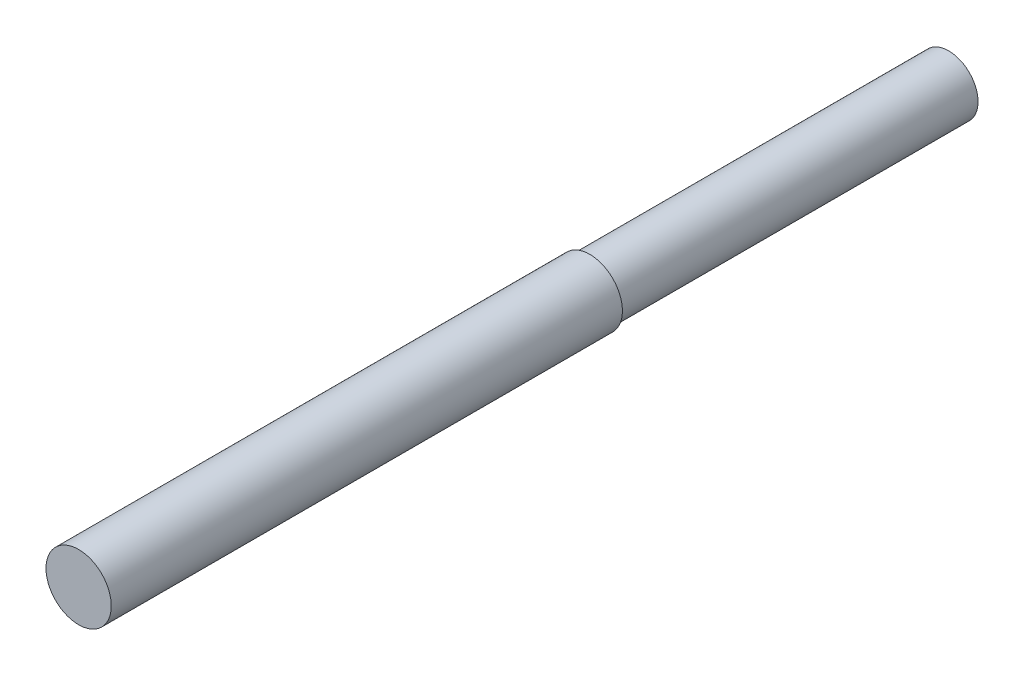
ISO-10303-21;
HEADER;
FILE_DESCRIPTION(('STEP AP214'),'2;1');
FILE_NAME('part.step','',(''),(''),'','','');
FILE_SCHEMA(('AUTOMOTIVE_DESIGN { 1 0 10303 214 1 1 1 1 }'));
ENDSEC;
DATA;
#1=APPLICATION_CONTEXT('core data for automotive mechanical design processes');
#2=APPLICATION_PROTOCOL_DEFINITION('international standard','automotive_design',2000,#1);
#3=PRODUCT_CONTEXT('',#1,'mechanical');
#4=PRODUCT('Part','Part','',(#3));
#5=PRODUCT_RELATED_PRODUCT_CATEGORY('part','',(#4));
#6=PRODUCT_DEFINITION_FORMATION('','',#4);
#7=PRODUCT_DEFINITION_CONTEXT('part definition',#1,'design');
#8=PRODUCT_DEFINITION('design','',#6,#7);
#9=PRODUCT_DEFINITION_SHAPE('','',#8);
#10=(LENGTH_UNIT() NAMED_UNIT(*) SI_UNIT(.MILLI.,.METRE.));
#11=(NAMED_UNIT(*) PLANE_ANGLE_UNIT() SI_UNIT($,.RADIAN.));
#12=(NAMED_UNIT(*) SI_UNIT($,.STERADIAN.) SOLID_ANGLE_UNIT());
#13=UNCERTAINTY_MEASURE_WITH_UNIT(LENGTH_MEASURE(1.E-05),#10,'distance_accuracy_value','');
#14=(GEOMETRIC_REPRESENTATION_CONTEXT(3) GLOBAL_UNCERTAINTY_ASSIGNED_CONTEXT((#13)) GLOBAL_UNIT_ASSIGNED_CONTEXT((#10,
#11,#12)) REPRESENTATION_CONTEXT('',''));
#15=CARTESIAN_POINT('',(0.,0.,0.));
#16=DIRECTION('',(0.,0.,1.));
#17=DIRECTION('',(1.,0.,0.));
#18=AXIS2_PLACEMENT_3D('',#15,#16,#17);
#19=CARTESIAN_POINT('',(0.,0.,470.));
#20=DIRECTION('',(0.,0.,-1.));
#21=DIRECTION('',(-1.,0.,0.));
#22=AXIS2_PLACEMENT_3D('',#19,#20,#21);
#23=CYLINDRICAL_SURFACE('',#22,30.);
#24=CARTESIAN_POINT('',(0.,0.,470.));
#25=DIRECTION('',(0.,0.,1.));
#26=DIRECTION('',(1.,0.,0.));
#27=AXIS2_PLACEMENT_3D('',#24,#25,#26);
#28=CIRCLE('',#27,30.);
#29=CARTESIAN_POINT('',(-30.,0.,470.));
#30=VERTEX_POINT('',#29);
#31=EDGE_CURVE('E44',#30,#30,#28,.T.);
#32=CARTESIAN_POINT('',(0.,0.,0.));
#33=DIRECTION('',(0.,0.,1.));
#34=DIRECTION('',(1.,0.,0.));
#35=AXIS2_PLACEMENT_3D('',#32,#33,#34);
#36=CIRCLE('',#35,30.);
#37=CARTESIAN_POINT('',(-30.,0.,0.));
#38=VERTEX_POINT('',#37);
#39=EDGE_CURVE('E40',#38,#38,#36,.T.);
#40=CARTESIAN_POINT('',(-30.,0.,470.));
#41=CARTESIAN_POINT('',(-30.,0.,465.104166666667));
#42=CARTESIAN_POINT('',(-30.,0.,460.208333333333));
#43=CARTESIAN_POINT('',(-30.,0.,450.416666666667));
#44=CARTESIAN_POINT('',(-30.,0.,445.520833333333));
#45=CARTESIAN_POINT('',(-30.,0.,435.729166666667));
#46=CARTESIAN_POINT('',(-30.,0.,430.833333333333));
#47=CARTESIAN_POINT('',(-30.,0.,421.041666666667));
#48=CARTESIAN_POINT('',(-30.,0.,416.145833333333));
#49=CARTESIAN_POINT('',(-30.,0.,406.354166666667));
#50=CARTESIAN_POINT('',(-30.,0.,401.458333333333));
#51=CARTESIAN_POINT('',(-30.,0.,391.666666666667));
#52=CARTESIAN_POINT('',(-30.,0.,386.770833333333));
#53=CARTESIAN_POINT('',(-30.,0.,376.979166666667));
#54=CARTESIAN_POINT('',(-30.,0.,372.083333333333));
#55=CARTESIAN_POINT('',(-30.,0.,362.291666666667));
#56=CARTESIAN_POINT('',(-30.,0.,357.395833333333));
#57=CARTESIAN_POINT('',(-30.,0.,347.604166666667));
#58=CARTESIAN_POINT('',(-30.,0.,342.708333333333));
#59=CARTESIAN_POINT('',(-30.,0.,332.916666666667));
#60=CARTESIAN_POINT('',(-30.,0.,328.020833333333));
#61=CARTESIAN_POINT('',(-30.,0.,318.229166666667));
#62=CARTESIAN_POINT('',(-30.,0.,313.333333333333));
#63=CARTESIAN_POINT('',(-30.,0.,303.541666666667));
#64=CARTESIAN_POINT('',(-30.,0.,298.645833333333));
#65=CARTESIAN_POINT('',(-30.,0.,288.854166666667));
#66=CARTESIAN_POINT('',(-30.,0.,283.958333333333));
#67=CARTESIAN_POINT('',(-30.,0.,274.166666666667));
#68=CARTESIAN_POINT('',(-30.,0.,269.270833333333));
#69=CARTESIAN_POINT('',(-30.,0.,259.479166666667));
#70=CARTESIAN_POINT('',(-30.,0.,254.583333333333));
#71=CARTESIAN_POINT('',(-30.,0.,244.791666666667));
#72=CARTESIAN_POINT('',(-30.,0.,239.895833333333));
#73=CARTESIAN_POINT('',(-30.,0.,230.104166666667));
#74=CARTESIAN_POINT('',(-30.,0.,225.208333333333));
#75=CARTESIAN_POINT('',(-30.,0.,215.416666666667));
#76=CARTESIAN_POINT('',(-30.,0.,210.520833333333));
#77=CARTESIAN_POINT('',(-30.,0.,200.729166666667));
#78=CARTESIAN_POINT('',(-30.,0.,195.833333333333));
#79=CARTESIAN_POINT('',(-30.,0.,186.041666666667));
#80=CARTESIAN_POINT('',(-30.,0.,181.145833333333));
#81=CARTESIAN_POINT('',(-30.,0.,171.354166666667));
#82=CARTESIAN_POINT('',(-30.,0.,166.458333333333));
#83=CARTESIAN_POINT('',(-30.,0.,156.666666666667));
#84=CARTESIAN_POINT('',(-30.,0.,151.770833333333));
#85=CARTESIAN_POINT('',(-30.,0.,141.979166666667));
#86=CARTESIAN_POINT('',(-30.,0.,137.083333333333));
#87=CARTESIAN_POINT('',(-30.,0.,127.291666666667));
#88=CARTESIAN_POINT('',(-30.,0.,122.395833333333));
#89=CARTESIAN_POINT('',(-30.,0.,112.604166666667));
#90=CARTESIAN_POINT('',(-30.,0.,107.708333333333));
#91=CARTESIAN_POINT('',(-30.,0.,97.9166666666666));
#92=CARTESIAN_POINT('',(-30.,0.,93.0208333333333));
#93=CARTESIAN_POINT('',(-30.,0.,83.2291666666666));
#94=CARTESIAN_POINT('',(-30.,0.,78.3333333333333));
#95=CARTESIAN_POINT('',(-30.,0.,68.5416666666666));
#96=CARTESIAN_POINT('',(-30.,0.,63.6458333333333));
#97=CARTESIAN_POINT('',(-30.,0.,53.8541666666666));
#98=CARTESIAN_POINT('',(-30.,0.,48.9583333333333));
#99=CARTESIAN_POINT('',(-30.,0.,39.1666666666666));
#100=CARTESIAN_POINT('',(-30.,0.,34.2708333333333));
#101=CARTESIAN_POINT('',(-30.,0.,24.4791666666666));
#102=CARTESIAN_POINT('',(-30.,0.,19.5833333333333));
#103=CARTESIAN_POINT('',(-30.,0.,9.79166666666662));
#104=CARTESIAN_POINT('',(-30.,0.,4.89583333333328));
#105=CARTESIAN_POINT('',(-30.,0.,0.));
#106=B_SPLINE_CURVE_WITH_KNOTS('',3,(#40,#41,#42,#43,#44,#45,#46,#47,#48,#49,#50,#51,#52,#53,
#54,#55,#56,#57,#58,#59,#60,#61,#62,#63,#64,#65,#66,#67,#68,#69,#70,#71,#72,#73,#74,#75,#76,#77,
#78,#79,#80,#81,#82,#83,#84,#85,#86,#87,#88,#89,#90,#91,#92,#93,#94,#95,#96,#97,#98,#99,#100,
#101,#102,#103,#104,#105),.UNSPECIFIED.,.F.,.F.,(4,2,2,2,2,2,2,2,2,2,2,2,2,2,2,2,2,2,2,2,2,2,2,
2,2,2,2,2,2,2,2,2,4),(0.,14.6875,29.375,44.0625,58.75,73.4375,88.125,102.8125,117.5,132.1875,
146.875,161.5625,176.25,190.9375,205.625,220.3125,235.,249.6875,264.375,279.0625,293.75,
308.4375,323.125,337.8125,352.5,367.1875,381.875,396.5625,411.25,425.9375,440.625,455.3125,
470.),.UNSPECIFIED.);
#107=EDGE_CURVE('BSEAM37',#30,#38,#106,.T.);
#108=ORIENTED_EDGE('',*,*,#31,.F.);
#109=ORIENTED_EDGE('',*,*,#39,.T.);
#110=ORIENTED_EDGE('',*,*,#107,.T.);
#111=ORIENTED_EDGE('',*,*,#107,.F.);
#112=EDGE_LOOP('',(#108,#110,#109,#111));
#113=FACE_BOUND('',#112,.T.);
#114=ADVANCED_FACE('F37',(#113),#23,.T.);
#115=CARTESIAN_POINT('',(0.,0.,470.));
#116=DIRECTION('',(0.,0.,1.));
#117=DIRECTION('',(1.,0.,0.));
#118=AXIS2_PLACEMENT_3D('',#115,#116,#117);
#119=PLANE('',#118);
#120=ORIENTED_EDGE('',*,*,#31,.T.);
#121=EDGE_LOOP('',(#120));
#122=FACE_BOUND('',#121,.T.);
#123=ADVANCED_FACE('F61',(#122),#119,.T.);
#124=CARTESIAN_POINT('',(0.,0.,0.));
#125=DIRECTION('',(0.,0.,1.));
#126=DIRECTION('',(1.,0.,0.));
#127=AXIS2_PLACEMENT_3D('',#124,#125,#126);
#128=PLANE('',#127);
#129=CARTESIAN_POINT('',(0.,0.,0.));
#130=DIRECTION('',(0.,0.,-1.));
#131=DIRECTION('',(-1.,0.,0.));
#132=AXIS2_PLACEMENT_3D('',#129,#130,#131);
#133=CIRCLE('',#132,27.);
#134=CARTESIAN_POINT('',(-27.,0.,0.));
#135=VERTEX_POINT('',#134);
#136=EDGE_CURVE('E10',#135,#135,#133,.T.);
#137=ORIENTED_EDGE('',*,*,#136,.F.);
#138=EDGE_LOOP('',(#137));
#139=FACE_BOUND('',#138,.T.);
#140=ORIENTED_EDGE('',*,*,#39,.F.);
#141=EDGE_LOOP('',(#140));
#142=FACE_BOUND('',#141,.T.);
#143=ADVANCED_FACE('F58',(#139,#142),#128,.F.);
#144=CARTESIAN_POINT('',(0.,0.,-330.));
#145=DIRECTION('',(0.,0.,1.));
#146=DIRECTION('',(1.,0.,0.));
#147=AXIS2_PLACEMENT_3D('',#144,#145,#146);
#148=CYLINDRICAL_SURFACE('',#147,27.);
#149=CARTESIAN_POINT('',(0.,0.,-330.));
#150=DIRECTION('',(0.,0.,-1.));
#151=DIRECTION('',(-1.,0.,0.));
#152=AXIS2_PLACEMENT_3D('',#149,#150,#151);
#153=CIRCLE('',#152,27.);
#154=CARTESIAN_POINT('',(-27.,0.,-330.));
#155=VERTEX_POINT('',#154);
#156=EDGE_CURVE('E50',#155,#155,#153,.T.);
#157=ORIENTED_EDGE('',*,*,#156,.F.);
#158=EDGE_LOOP('',(#157));
#159=FACE_BOUND('',#158,.T.);
#160=ORIENTED_EDGE('',*,*,#136,.T.);
#161=EDGE_LOOP('',(#160));
#162=FACE_BOUND('',#161,.T.);
#163=ADVANCED_FACE('F60',(#159,#162),#148,.T.);
#164=CARTESIAN_POINT('',(0.,0.,-330.));
#165=DIRECTION('',(0.,0.,-1.));
#166=DIRECTION('',(-1.,0.,0.));
#167=AXIS2_PLACEMENT_3D('',#164,#165,#166);
#168=PLANE('',#167);
#169=ORIENTED_EDGE('',*,*,#156,.T.);
#170=EDGE_LOOP('',(#169));
#171=FACE_BOUND('',#170,.T.);
#172=ADVANCED_FACE('F67',(#171),#168,.T.);
#173=CLOSED_SHELL('',(#114,#123,#143,#163,#172));
#174=MANIFOLD_SOLID_BREP('B2',#173);
#175=ADVANCED_BREP_SHAPE_REPRESENTATION('',(#18,#174),#14);
#176=SHAPE_DEFINITION_REPRESENTATION(#9,#175);
ENDSEC;
END-ISO-10303-21;
